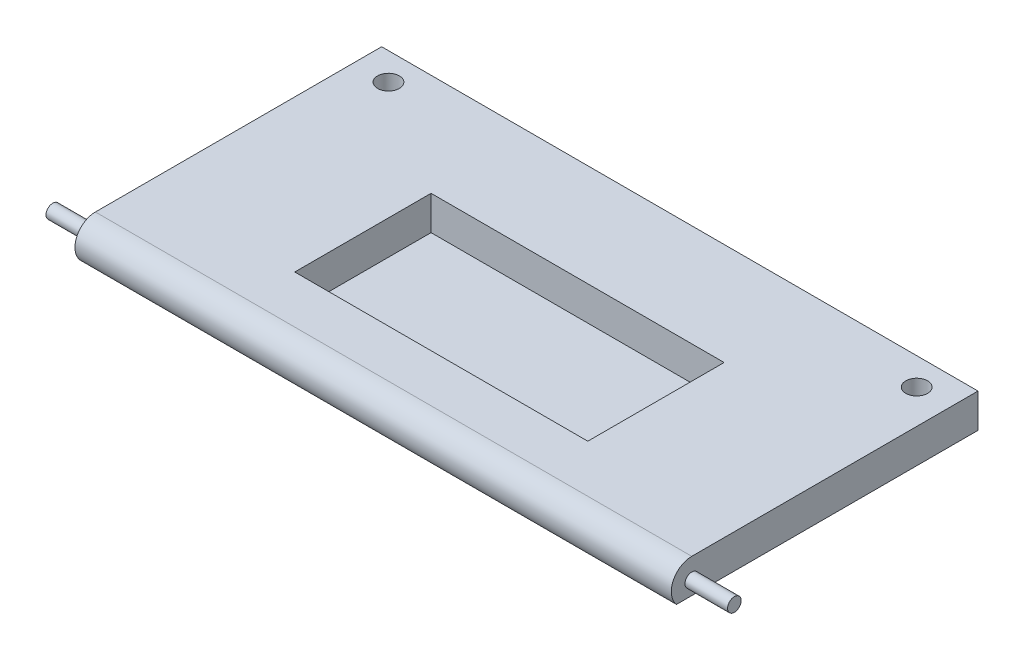
ISO-10303-21;
HEADER;
FILE_DESCRIPTION(('STEP AP214'),'2;1');
FILE_NAME('part.step','',(''),(''),'','','');
FILE_SCHEMA(('AUTOMOTIVE_DESIGN { 1 0 10303 214 1 1 1 1 }'));
ENDSEC;
DATA;
#1=APPLICATION_CONTEXT('core data for automotive mechanical design processes');
#2=APPLICATION_PROTOCOL_DEFINITION('international standard','automotive_design',2000,#1);
#3=PRODUCT_CONTEXT('',#1,'mechanical');
#4=PRODUCT('Part','Part','',(#3));
#5=PRODUCT_RELATED_PRODUCT_CATEGORY('part','',(#4));
#6=PRODUCT_DEFINITION_FORMATION('','',#4);
#7=PRODUCT_DEFINITION_CONTEXT('part definition',#1,'design');
#8=PRODUCT_DEFINITION('design','',#6,#7);
#9=PRODUCT_DEFINITION_SHAPE('','',#8);
#10=(LENGTH_UNIT() NAMED_UNIT(*) SI_UNIT(.MILLI.,.METRE.));
#11=(NAMED_UNIT(*) PLANE_ANGLE_UNIT() SI_UNIT($,.RADIAN.));
#12=(NAMED_UNIT(*) SI_UNIT($,.STERADIAN.) SOLID_ANGLE_UNIT());
#13=UNCERTAINTY_MEASURE_WITH_UNIT(LENGTH_MEASURE(1.E-05),#10,'distance_accuracy_value','');
#14=(GEOMETRIC_REPRESENTATION_CONTEXT(3) GLOBAL_UNCERTAINTY_ASSIGNED_CONTEXT((#13)) GLOBAL_UNIT_ASSIGNED_CONTEXT((#10,
#11,#12)) REPRESENTATION_CONTEXT('',''));
#15=CARTESIAN_POINT('',(0.,0.,0.));
#16=DIRECTION('',(0.,0.,1.));
#17=DIRECTION('',(1.,0.,0.));
#18=AXIS2_PLACEMENT_3D('',#15,#16,#17);
#19=CARTESIAN_POINT('',(-43.75,-0.5,42.));
#20=DIRECTION('',(-1.,0.,0.));
#21=DIRECTION('',(0.,0.,1.));
#22=AXIS2_PLACEMENT_3D('',#19,#20,#21);
#23=CYLINDRICAL_SURFACE('',#22,3.);
#24=DIRECTION('',(-1.,0.,0.));
#25=VECTOR('',#24,1.);
#26=CARTESIAN_POINT('',(-43.75,2.5,42.));
#27=LINE('',#26,#25);
#28=CARTESIAN_POINT('',(-43.75,2.5,42.));
#29=VERTEX_POINT('',#28);
#30=CARTESIAN_POINT('',(43.75,2.5,42.));
#31=VERTEX_POINT('',#30);
#32=EDGE_CURVE('E209',#29,#31,#27,.F.);
#33=ORIENTED_EDGE('',*,*,#32,.F.);
#34=CARTESIAN_POINT('',(-43.75,-0.5,42.));
#35=DIRECTION('',(1.,0.,0.));
#36=DIRECTION('',(0.,0.,-1.));
#37=AXIS2_PLACEMENT_3D('',#34,#35,#36);
#38=CIRCLE('',#37,3.);
#39=CARTESIAN_POINT('',(-43.75,-2.5,44.2360679774998));
#40=VERTEX_POINT('',#39);
#41=EDGE_CURVE('E11',#40,#29,#38,.F.);
#42=ORIENTED_EDGE('',*,*,#41,.F.);
#43=DIRECTION('',(-1.,0.,0.));
#44=VECTOR('',#43,1.);
#45=CARTESIAN_POINT('',(-43.75,-2.5,44.2360679774998));
#46=LINE('',#45,#44);
#47=CARTESIAN_POINT('',(-34.,-2.5,44.2360679774998));
#48=VERTEX_POINT('',#47);
#49=EDGE_CURVE('E48',#48,#40,#46,.T.);
#50=ORIENTED_EDGE('',*,*,#49,.F.);
#51=CARTESIAN_POINT('',(-34.,-0.5,42.));
#52=DIRECTION('',(1.,0.,0.));
#53=DIRECTION('',(0.,0.,-1.));
#54=AXIS2_PLACEMENT_3D('',#51,#52,#53);
#55=CIRCLE('',#54,3.);
#56=CARTESIAN_POINT('',(-34.,-3.5,42.));
#57=VERTEX_POINT('',#56);
#58=EDGE_CURVE('E224',#57,#48,#55,.F.);
#59=ORIENTED_EDGE('',*,*,#58,.F.);
#60=DIRECTION('',(-1.,0.,0.));
#61=VECTOR('',#60,1.);
#62=CARTESIAN_POINT('',(-34.,-3.5,42.));
#63=LINE('',#62,#61);
#64=CARTESIAN_POINT('',(34.,-3.5,42.));
#65=VERTEX_POINT('',#64);
#66=EDGE_CURVE('E221',#65,#57,#63,.T.);
#67=ORIENTED_EDGE('',*,*,#66,.F.);
#68=CARTESIAN_POINT('',(34.,-0.5,42.));
#69=DIRECTION('',(-1.,0.,0.));
#70=DIRECTION('',(0.,0.,1.));
#71=AXIS2_PLACEMENT_3D('',#68,#69,#70);
#72=CIRCLE('',#71,3.);
#73=CARTESIAN_POINT('',(34.,-2.5,44.2360679774998));
#74=VERTEX_POINT('',#73);
#75=EDGE_CURVE('E218',#74,#65,#72,.F.);
#76=ORIENTED_EDGE('',*,*,#75,.F.);
#77=DIRECTION('',(-1.,0.,0.));
#78=VECTOR('',#77,1.);
#79=CARTESIAN_POINT('',(-43.75,-2.5,44.2360679774998));
#80=LINE('',#79,#78);
#81=CARTESIAN_POINT('',(43.75,-2.5,44.2360679774998));
#82=VERTEX_POINT('',#81);
#83=EDGE_CURVE('E215',#82,#74,#80,.T.);
#84=ORIENTED_EDGE('',*,*,#83,.F.);
#85=CARTESIAN_POINT('',(43.75,-0.5,42.));
#86=DIRECTION('',(-1.,0.,0.));
#87=DIRECTION('',(0.,0.,1.));
#88=AXIS2_PLACEMENT_3D('',#85,#86,#87);
#89=CIRCLE('',#88,3.);
#90=EDGE_CURVE('E212',#31,#82,#89,.F.);
#91=ORIENTED_EDGE('',*,*,#90,.F.);
#92=EDGE_LOOP('',(#33,#42,#50,#59,#67,#76,#84,#91));
#93=FACE_BOUND('',#92,.T.);
#94=ADVANCED_FACE('F39',(#93),#23,.T.);
#95=CARTESIAN_POINT('',(43.75,-2.5,45.));
#96=DIRECTION('',(-1.,0.,0.));
#97=DIRECTION('',(0.,0.,1.));
#98=AXIS2_PLACEMENT_3D('',#95,#96,#97);
#99=PLANE('',#98);
#100=CARTESIAN_POINT('',(43.75,-0.5,42.));
#101=DIRECTION('',(-1.,0.,0.));
#102=DIRECTION('',(0.,0.,1.));
#103=AXIS2_PLACEMENT_3D('',#100,#101,#102);
#104=CIRCLE('',#103,0.999999999999998);
#105=CARTESIAN_POINT('',(43.75,-0.5,41.));
#106=VERTEX_POINT('',#105);
#107=EDGE_CURVE('E154',#106,#106,#104,.T.);
#108=ORIENTED_EDGE('',*,*,#107,.T.);
#109=EDGE_LOOP('',(#108));
#110=FACE_BOUND('',#109,.T.);
#111=DIRECTION('',(0.,0.,-1.));
#112=VECTOR('',#111,1.);
#113=CARTESIAN_POINT('',(43.75,2.5,45.));
#114=LINE('',#113,#112);
#115=CARTESIAN_POINT('',(43.75,2.5,0.));
#116=VERTEX_POINT('',#115);
#117=EDGE_CURVE('E207',#31,#116,#114,.T.);
#118=ORIENTED_EDGE('',*,*,#117,.F.);
#119=ORIENTED_EDGE('',*,*,#90,.T.);
#120=DIRECTION('',(0.,0.,-1.));
#121=VECTOR('',#120,1.);
#122=CARTESIAN_POINT('',(43.75,-2.5,45.));
#123=LINE('',#122,#121);
#124=CARTESIAN_POINT('',(43.75,-2.5,0.));
#125=VERTEX_POINT('',#124);
#126=EDGE_CURVE('E193',#82,#125,#123,.T.);
#127=ORIENTED_EDGE('',*,*,#126,.T.);
#128=DIRECTION('',(0.,1.,0.));
#129=VECTOR('',#128,1.);
#130=CARTESIAN_POINT('',(43.75,-2.5,0.));
#131=LINE('',#130,#129);
#132=EDGE_CURVE('E166',#125,#116,#131,.T.);
#133=ORIENTED_EDGE('',*,*,#132,.T.);
#134=EDGE_LOOP('',(#118,#119,#127,#133));
#135=FACE_BOUND('',#134,.T.);
#136=ADVANCED_FACE('F257',(#110,#135),#99,.F.);
#137=CARTESIAN_POINT('',(-43.75,2.5,45.));
#138=DIRECTION('',(0.,-1.,0.));
#139=DIRECTION('',(0.,0.,-1.));
#140=AXIS2_PLACEMENT_3D('',#137,#138,#139);
#141=PLANE('',#140);
#142=CARTESIAN_POINT('',(38.75,2.5,4.));
#143=DIRECTION('',(0.,-1.,0.));
#144=DIRECTION('',(0.,0.,-1.));
#145=AXIS2_PLACEMENT_3D('',#142,#143,#144);
#146=CIRCLE('',#145,1.6);
#147=CARTESIAN_POINT('',(38.75,2.5,2.4));
#148=VERTEX_POINT('',#147);
#149=EDGE_CURVE('E456',#148,#148,#146,.T.);
#150=ORIENTED_EDGE('',*,*,#149,.T.);
#151=EDGE_LOOP('',(#150));
#152=FACE_BOUND('',#151,.T.);
#153=CARTESIAN_POINT('',(-38.75,2.5,4.));
#154=DIRECTION('',(0.,-1.,0.));
#155=DIRECTION('',(0.,0.,-1.));
#156=AXIS2_PLACEMENT_3D('',#153,#154,#155);
#157=CIRCLE('',#156,1.6);
#158=CARTESIAN_POINT('',(-38.75,2.5,2.4));
#159=VERTEX_POINT('',#158);
#160=EDGE_CURVE('E463',#159,#159,#157,.F.);
#161=ORIENTED_EDGE('',*,*,#160,.F.);
#162=EDGE_LOOP('',(#161));
#163=FACE_BOUND('',#162,.T.);
#164=DIRECTION('',(-1.,0.,0.));
#165=VECTOR('',#164,1.);
#166=CARTESIAN_POINT('',(-21.5,2.5,15.));
#167=LINE('',#166,#165);
#168=CARTESIAN_POINT('',(21.5,2.5,15.));
#169=VERTEX_POINT('',#168);
#170=CARTESIAN_POINT('',(-21.5,2.5,15.));
#171=VERTEX_POINT('',#170);
#172=EDGE_CURVE('E160',#169,#171,#167,.T.);
#173=ORIENTED_EDGE('',*,*,#172,.F.);
#174=DIRECTION('',(0.,0.,-1.));
#175=VECTOR('',#174,1.);
#176=CARTESIAN_POINT('',(21.5,2.5,35.));
#177=LINE('',#176,#175);
#178=CARTESIAN_POINT('',(21.5,2.5,35.));
#179=VERTEX_POINT('',#178);
#180=EDGE_CURVE('E131',#179,#169,#177,.T.);
#181=ORIENTED_EDGE('',*,*,#180,.F.);
#182=DIRECTION('',(1.,0.,0.));
#183=VECTOR('',#182,1.);
#184=CARTESIAN_POINT('',(-21.5,2.5,35.));
#185=LINE('',#184,#183);
#186=CARTESIAN_POINT('',(-21.5,2.5,35.));
#187=VERTEX_POINT('',#186);
#188=EDGE_CURVE('E148',#187,#179,#185,.T.);
#189=ORIENTED_EDGE('',*,*,#188,.F.);
#190=DIRECTION('',(0.,0.,1.));
#191=VECTOR('',#190,1.);
#192=CARTESIAN_POINT('',(-21.5,2.5,35.));
#193=LINE('',#192,#191);
#194=EDGE_CURVE('E151',#171,#187,#193,.T.);
#195=ORIENTED_EDGE('',*,*,#194,.F.);
#196=EDGE_LOOP('',(#173,#181,#189,#195));
#197=FACE_BOUND('',#196,.T.);
#198=DIRECTION('',(0.,0.,-1.));
#199=VECTOR('',#198,1.);
#200=CARTESIAN_POINT('',(-43.75,2.5,45.));
#201=LINE('',#200,#199);
#202=CARTESIAN_POINT('',(-43.75,2.5,0.));
#203=VERTEX_POINT('',#202);
#204=EDGE_CURVE('E205',#29,#203,#201,.T.);
#205=ORIENTED_EDGE('',*,*,#204,.F.);
#206=ORIENTED_EDGE('',*,*,#32,.T.);
#207=ORIENTED_EDGE('',*,*,#117,.T.);
#208=DIRECTION('',(-1.,0.,0.));
#209=VECTOR('',#208,1.);
#210=CARTESIAN_POINT('',(-43.75,2.5,0.));
#211=LINE('',#210,#209);
#212=EDGE_CURVE('E172',#116,#203,#211,.T.);
#213=ORIENTED_EDGE('',*,*,#212,.T.);
#214=EDGE_LOOP('',(#205,#206,#207,#213));
#215=FACE_BOUND('',#214,.T.);
#216=ADVANCED_FACE('F259',(#152,#163,#197,#215),#141,.F.);
#217=CARTESIAN_POINT('',(-43.75,-2.5,45.));
#218=DIRECTION('',(1.,0.,0.));
#219=DIRECTION('',(0.,0.,-1.));
#220=AXIS2_PLACEMENT_3D('',#217,#218,#219);
#221=PLANE('',#220);
#222=CARTESIAN_POINT('',(-43.75,-0.5,42.));
#223=DIRECTION('',(1.,0.,0.));
#224=DIRECTION('',(0.,0.,-1.));
#225=AXIS2_PLACEMENT_3D('',#222,#223,#224);
#226=CIRCLE('',#225,0.999999999999998);
#227=CARTESIAN_POINT('',(-43.75,-0.5,41.));
#228=VERTEX_POINT('',#227);
#229=EDGE_CURVE('E43',#228,#228,#226,.T.);
#230=ORIENTED_EDGE('',*,*,#229,.T.);
#231=EDGE_LOOP('',(#230));
#232=FACE_BOUND('',#231,.T.);
#233=DIRECTION('',(0.,0.,-1.));
#234=VECTOR('',#233,1.);
#235=CARTESIAN_POINT('',(-43.75,-2.5,45.));
#236=LINE('',#235,#234);
#237=CARTESIAN_POINT('',(-43.75,-2.5,0.));
#238=VERTEX_POINT('',#237);
#239=EDGE_CURVE('E203',#40,#238,#236,.T.);
#240=ORIENTED_EDGE('',*,*,#239,.F.);
#241=ORIENTED_EDGE('',*,*,#41,.T.);
#242=ORIENTED_EDGE('',*,*,#204,.T.);
#243=DIRECTION('',(0.,-1.,0.));
#244=VECTOR('',#243,1.);
#245=CARTESIAN_POINT('',(-43.75,-2.5,0.));
#246=LINE('',#245,#244);
#247=EDGE_CURVE('E175',#203,#238,#246,.T.);
#248=ORIENTED_EDGE('',*,*,#247,.T.);
#249=EDGE_LOOP('',(#240,#241,#242,#248));
#250=FACE_BOUND('',#249,.T.);
#251=ADVANCED_FACE('F231',(#232,#250),#221,.F.);
#252=CARTESIAN_POINT('',(-43.75,-2.5,45.));
#253=DIRECTION('',(0.,1.,0.));
#254=DIRECTION('',(0.,0.,1.));
#255=AXIS2_PLACEMENT_3D('',#252,#253,#254);
#256=PLANE('',#255);
#257=CARTESIAN_POINT('',(-38.75,-2.5,4.));
#258=DIRECTION('',(0.,-1.,0.));
#259=DIRECTION('',(0.,0.,-1.));
#260=AXIS2_PLACEMENT_3D('',#257,#258,#259);
#261=CIRCLE('',#260,1.6);
#262=CARTESIAN_POINT('',(-38.75,-2.5,2.4));
#263=VERTEX_POINT('',#262);
#264=EDGE_CURVE('E458',#263,#263,#261,.T.);
#265=ORIENTED_EDGE('',*,*,#264,.F.);
#266=EDGE_LOOP('',(#265));
#267=FACE_BOUND('',#266,.T.);
#268=DIRECTION('',(0.,0.,-1.));
#269=VECTOR('',#268,1.);
#270=CARTESIAN_POINT('',(-34.,-2.5,45.));
#271=LINE('',#270,#269);
#272=CARTESIAN_POINT('',(-34.,-2.5,0.));
#273=VERTEX_POINT('',#272);
#274=EDGE_CURVE('E201',#48,#273,#271,.T.);
#275=ORIENTED_EDGE('',*,*,#274,.F.);
#276=ORIENTED_EDGE('',*,*,#49,.T.);
#277=ORIENTED_EDGE('',*,*,#239,.T.);
#278=DIRECTION('',(1.,0.,0.));
#279=VECTOR('',#278,1.);
#280=CARTESIAN_POINT('',(-43.75,-2.5,0.));
#281=LINE('',#280,#279);
#282=EDGE_CURVE('E178',#238,#273,#281,.T.);
#283=ORIENTED_EDGE('',*,*,#282,.T.);
#284=EDGE_LOOP('',(#275,#276,#277,#283));
#285=FACE_BOUND('',#284,.T.);
#286=ADVANCED_FACE('F229',(#267,#285),#256,.F.);
#287=CARTESIAN_POINT('',(-34.,-3.5,45.));
#288=DIRECTION('',(1.,0.,0.));
#289=DIRECTION('',(0.,0.,-1.));
#290=AXIS2_PLACEMENT_3D('',#287,#288,#289);
#291=PLANE('',#290);
#292=DIRECTION('',(0.,0.,-1.));
#293=VECTOR('',#292,1.);
#294=CARTESIAN_POINT('',(-34.,-3.5,45.));
#295=LINE('',#294,#293);
#296=CARTESIAN_POINT('',(-34.,-3.5,0.));
#297=VERTEX_POINT('',#296);
#298=EDGE_CURVE('E199',#57,#297,#295,.T.);
#299=ORIENTED_EDGE('',*,*,#298,.F.);
#300=ORIENTED_EDGE('',*,*,#58,.T.);
#301=ORIENTED_EDGE('',*,*,#274,.T.);
#302=DIRECTION('',(0.,-1.,0.));
#303=VECTOR('',#302,1.);
#304=CARTESIAN_POINT('',(-34.,-3.5,0.));
#305=LINE('',#304,#303);
#306=EDGE_CURVE('E181',#273,#297,#305,.T.);
#307=ORIENTED_EDGE('',*,*,#306,.T.);
#308=EDGE_LOOP('',(#299,#300,#301,#307));
#309=FACE_BOUND('',#308,.T.);
#310=ADVANCED_FACE('F244',(#309),#291,.F.);
#311=CARTESIAN_POINT('',(-34.,-3.5,45.));
#312=DIRECTION('',(0.,1.,0.));
#313=DIRECTION('',(0.,0.,1.));
#314=AXIS2_PLACEMENT_3D('',#311,#312,#313);
#315=PLANE('',#314);
#316=DIRECTION('',(0.,0.,-1.));
#317=VECTOR('',#316,1.);
#318=CARTESIAN_POINT('',(34.,-3.5,45.));
#319=LINE('',#318,#317);
#320=CARTESIAN_POINT('',(34.,-3.5,0.));
#321=VERTEX_POINT('',#320);
#322=EDGE_CURVE('E197',#65,#321,#319,.T.);
#323=ORIENTED_EDGE('',*,*,#322,.F.);
#324=ORIENTED_EDGE('',*,*,#66,.T.);
#325=ORIENTED_EDGE('',*,*,#298,.T.);
#326=DIRECTION('',(1.,0.,0.));
#327=VECTOR('',#326,1.);
#328=CARTESIAN_POINT('',(-34.,-3.5,0.));
#329=LINE('',#328,#327);
#330=EDGE_CURVE('E184',#297,#321,#329,.T.);
#331=ORIENTED_EDGE('',*,*,#330,.T.);
#332=EDGE_LOOP('',(#323,#324,#325,#331));
#333=FACE_BOUND('',#332,.T.);
#334=ADVANCED_FACE('F247',(#333),#315,.F.);
#335=CARTESIAN_POINT('',(34.,-3.5,45.));
#336=DIRECTION('',(-1.,0.,0.));
#337=DIRECTION('',(0.,0.,1.));
#338=AXIS2_PLACEMENT_3D('',#335,#336,#337);
#339=PLANE('',#338);
#340=DIRECTION('',(0.,0.,-1.));
#341=VECTOR('',#340,1.);
#342=CARTESIAN_POINT('',(34.,-2.5,45.));
#343=LINE('',#342,#341);
#344=CARTESIAN_POINT('',(34.,-2.5,0.));
#345=VERTEX_POINT('',#344);
#346=EDGE_CURVE('E195',#74,#345,#343,.T.);
#347=ORIENTED_EDGE('',*,*,#346,.F.);
#348=ORIENTED_EDGE('',*,*,#75,.T.);
#349=ORIENTED_EDGE('',*,*,#322,.T.);
#350=DIRECTION('',(0.,1.,0.));
#351=VECTOR('',#350,1.);
#352=CARTESIAN_POINT('',(34.,-3.5,0.));
#353=LINE('',#352,#351);
#354=EDGE_CURVE('E187',#321,#345,#353,.T.);
#355=ORIENTED_EDGE('',*,*,#354,.T.);
#356=EDGE_LOOP('',(#347,#348,#349,#355));
#357=FACE_BOUND('',#356,.T.);
#358=ADVANCED_FACE('F250',(#357),#339,.F.);
#359=CARTESIAN_POINT('',(34.,-2.5,45.));
#360=DIRECTION('',(0.,1.,0.));
#361=DIRECTION('',(0.,0.,1.));
#362=AXIS2_PLACEMENT_3D('',#359,#360,#361);
#363=PLANE('',#362);
#364=CARTESIAN_POINT('',(38.75,-2.5,4.));
#365=DIRECTION('',(0.,1.,0.));
#366=DIRECTION('',(0.,0.,-1.));
#367=AXIS2_PLACEMENT_3D('',#364,#365,#366);
#368=CIRCLE('',#367,1.6);
#369=CARTESIAN_POINT('',(38.75,-2.5,2.4));
#370=VERTEX_POINT('',#369);
#371=EDGE_CURVE('E454',#370,#370,#368,.T.);
#372=ORIENTED_EDGE('',*,*,#371,.T.);
#373=EDGE_LOOP('',(#372));
#374=FACE_BOUND('',#373,.T.);
#375=ORIENTED_EDGE('',*,*,#126,.F.);
#376=ORIENTED_EDGE('',*,*,#83,.T.);
#377=ORIENTED_EDGE('',*,*,#346,.T.);
#378=DIRECTION('',(1.,0.,0.));
#379=VECTOR('',#378,1.);
#380=CARTESIAN_POINT('',(34.,-2.5,0.));
#381=LINE('',#380,#379);
#382=EDGE_CURVE('E190',#345,#125,#381,.T.);
#383=ORIENTED_EDGE('',*,*,#382,.T.);
#384=EDGE_LOOP('',(#375,#376,#377,#383));
#385=FACE_BOUND('',#384,.T.);
#386=ADVANCED_FACE('F254',(#374,#385),#363,.F.);
#387=CARTESIAN_POINT('',(0.,0.,0.));
#388=DIRECTION('',(0.,0.,-1.));
#389=DIRECTION('',(-1.,0.,0.));
#390=AXIS2_PLACEMENT_3D('',#387,#388,#389);
#391=PLANE('',#390);
#392=ORIENTED_EDGE('',*,*,#132,.F.);
#393=ORIENTED_EDGE('',*,*,#382,.F.);
#394=ORIENTED_EDGE('',*,*,#354,.F.);
#395=ORIENTED_EDGE('',*,*,#330,.F.);
#396=ORIENTED_EDGE('',*,*,#306,.F.);
#397=ORIENTED_EDGE('',*,*,#282,.F.);
#398=ORIENTED_EDGE('',*,*,#247,.F.);
#399=ORIENTED_EDGE('',*,*,#212,.F.);
#400=EDGE_LOOP('',(#392,#393,#394,#395,#396,#397,#398,#399));
#401=FACE_BOUND('',#400,.T.);
#402=ADVANCED_FACE('F239',(#401),#391,.T.);
#403=CARTESIAN_POINT('',(21.5,-2.5,35.));
#404=DIRECTION('',(1.,0.,0.));
#405=DIRECTION('',(0.,0.,-1.));
#406=AXIS2_PLACEMENT_3D('',#403,#404,#405);
#407=PLANE('',#406);
#408=ORIENTED_EDGE('',*,*,#180,.T.);
#409=DIRECTION('',(0.,1.,0.));
#410=VECTOR('',#409,1.);
#411=CARTESIAN_POINT('',(21.5,-2.5,15.));
#412=LINE('',#411,#410);
#413=CARTESIAN_POINT('',(21.5,-2.5,15.));
#414=VERTEX_POINT('',#413);
#415=EDGE_CURVE('E124',#414,#169,#412,.T.);
#416=ORIENTED_EDGE('',*,*,#415,.F.);
#417=DIRECTION('',(0.,0.,-1.));
#418=VECTOR('',#417,1.);
#419=CARTESIAN_POINT('',(21.5,-2.5,35.));
#420=LINE('',#419,#418);
#421=CARTESIAN_POINT('',(21.5,-2.5,35.));
#422=VERTEX_POINT('',#421);
#423=EDGE_CURVE('E128',#422,#414,#420,.T.);
#424=ORIENTED_EDGE('',*,*,#423,.F.);
#425=DIRECTION('',(0.,1.,0.));
#426=VECTOR('',#425,1.);
#427=CARTESIAN_POINT('',(21.5,-2.5,35.));
#428=LINE('',#427,#426);
#429=EDGE_CURVE('E164',#422,#179,#428,.T.);
#430=ORIENTED_EDGE('',*,*,#429,.T.);
#431=EDGE_LOOP('',(#408,#416,#424,#430));
#432=FACE_BOUND('',#431,.T.);
#433=ADVANCED_FACE('F126',(#432),#407,.F.);
#434=CARTESIAN_POINT('',(-21.5,-2.5,35.));
#435=DIRECTION('',(0.,0.,1.));
#436=DIRECTION('',(1.,0.,0.));
#437=AXIS2_PLACEMENT_3D('',#434,#435,#436);
#438=PLANE('',#437);
#439=ORIENTED_EDGE('',*,*,#188,.T.);
#440=ORIENTED_EDGE('',*,*,#429,.F.);
#441=DIRECTION('',(1.,0.,0.));
#442=VECTOR('',#441,1.);
#443=CARTESIAN_POINT('',(-21.5,-2.5,35.));
#444=LINE('',#443,#442);
#445=CARTESIAN_POINT('',(-21.5,-2.5,35.));
#446=VERTEX_POINT('',#445);
#447=EDGE_CURVE('E136',#446,#422,#444,.T.);
#448=ORIENTED_EDGE('',*,*,#447,.F.);
#449=DIRECTION('',(0.,1.,0.));
#450=VECTOR('',#449,1.);
#451=CARTESIAN_POINT('',(-21.5,-2.5,35.));
#452=LINE('',#451,#450);
#453=EDGE_CURVE('E167',#446,#187,#452,.T.);
#454=ORIENTED_EDGE('',*,*,#453,.T.);
#455=EDGE_LOOP('',(#439,#440,#448,#454));
#456=FACE_BOUND('',#455,.T.);
#457=ADVANCED_FACE('F386',(#456),#438,.F.);
#458=CARTESIAN_POINT('',(-21.5,-2.5,35.));
#459=DIRECTION('',(-1.,0.,0.));
#460=DIRECTION('',(0.,0.,1.));
#461=AXIS2_PLACEMENT_3D('',#458,#459,#460);
#462=PLANE('',#461);
#463=ORIENTED_EDGE('',*,*,#194,.T.);
#464=ORIENTED_EDGE('',*,*,#453,.F.);
#465=DIRECTION('',(0.,0.,1.));
#466=VECTOR('',#465,1.);
#467=CARTESIAN_POINT('',(-21.5,-2.5,35.));
#468=LINE('',#467,#466);
#469=CARTESIAN_POINT('',(-21.5,-2.5,15.));
#470=VERTEX_POINT('',#469);
#471=EDGE_CURVE('E144',#470,#446,#468,.T.);
#472=ORIENTED_EDGE('',*,*,#471,.F.);
#473=DIRECTION('',(0.,1.,0.));
#474=VECTOR('',#473,1.);
#475=CARTESIAN_POINT('',(-21.5,-2.5,15.));
#476=LINE('',#475,#474);
#477=EDGE_CURVE('E135',#470,#171,#476,.T.);
#478=ORIENTED_EDGE('',*,*,#477,.T.);
#479=EDGE_LOOP('',(#463,#464,#472,#478));
#480=FACE_BOUND('',#479,.T.);
#481=ADVANCED_FACE('F389',(#480),#462,.F.);
#482=CARTESIAN_POINT('',(-21.5,-2.5,15.));
#483=DIRECTION('',(0.,0.,-1.));
#484=DIRECTION('',(-1.,0.,0.));
#485=AXIS2_PLACEMENT_3D('',#482,#483,#484);
#486=PLANE('',#485);
#487=ORIENTED_EDGE('',*,*,#172,.T.);
#488=ORIENTED_EDGE('',*,*,#477,.F.);
#489=DIRECTION('',(-1.,0.,0.));
#490=VECTOR('',#489,1.);
#491=CARTESIAN_POINT('',(-21.5,-2.5,15.));
#492=LINE('',#491,#490);
#493=EDGE_CURVE('E139',#414,#470,#492,.T.);
#494=ORIENTED_EDGE('',*,*,#493,.F.);
#495=ORIENTED_EDGE('',*,*,#415,.T.);
#496=EDGE_LOOP('',(#487,#488,#494,#495));
#497=FACE_BOUND('',#496,.T.);
#498=ADVANCED_FACE('F140',(#497),#486,.F.);
#499=CARTESIAN_POINT('',(0.,-2.5,0.));
#500=DIRECTION('',(0.,-1.,0.));
#501=DIRECTION('',(0.,0.,-1.));
#502=AXIS2_PLACEMENT_3D('',#499,#500,#501);
#503=PLANE('',#502);
#504=ORIENTED_EDGE('',*,*,#423,.T.);
#505=ORIENTED_EDGE('',*,*,#493,.T.);
#506=ORIENTED_EDGE('',*,*,#471,.T.);
#507=ORIENTED_EDGE('',*,*,#447,.T.);
#508=EDGE_LOOP('',(#504,#505,#506,#507));
#509=FACE_BOUND('',#508,.T.);
#510=ADVANCED_FACE('F146',(#509),#503,.F.);
#511=CARTESIAN_POINT('',(-50.,-0.5,42.));
#512=DIRECTION('',(1.,0.,0.));
#513=DIRECTION('',(0.,0.,-1.));
#514=AXIS2_PLACEMENT_3D('',#511,#512,#513);
#515=PLANE('',#514);
#516=CARTESIAN_POINT('',(-50.,-0.5,42.));
#517=DIRECTION('',(1.,0.,0.));
#518=DIRECTION('',(0.,0.,-1.));
#519=AXIS2_PLACEMENT_3D('',#516,#517,#518);
#520=CIRCLE('',#519,0.999999999999998);
#521=CARTESIAN_POINT('',(-50.,-0.5,41.));
#522=VERTEX_POINT('',#521);
#523=EDGE_CURVE('E467',#522,#522,#520,.T.);
#524=ORIENTED_EDGE('',*,*,#523,.F.);
#525=EDGE_LOOP('',(#524));
#526=FACE_BOUND('',#525,.T.);
#527=ADVANCED_FACE('F300',(#526),#515,.F.);
#528=CARTESIAN_POINT('',(-50.,-0.5,42.));
#529=DIRECTION('',(1.,0.,0.));
#530=DIRECTION('',(0.,0.,-1.));
#531=AXIS2_PLACEMENT_3D('',#528,#529,#530);
#532=CYLINDRICAL_SURFACE('',#531,0.999999999999998);
#533=CARTESIAN_POINT('',(-50.,-0.5,41.));
#534=CARTESIAN_POINT('',(-49.9348958333333,-0.5,41.));
#535=CARTESIAN_POINT('',(-49.8697916666667,-0.5,41.));
#536=CARTESIAN_POINT('',(-49.7395833333333,-0.5,41.));
#537=CARTESIAN_POINT('',(-49.6744791666667,-0.5,41.));
#538=CARTESIAN_POINT('',(-49.5442708333333,-0.5,41.));
#539=CARTESIAN_POINT('',(-49.4791666666667,-0.5,41.));
#540=CARTESIAN_POINT('',(-49.3489583333333,-0.5,41.));
#541=CARTESIAN_POINT('',(-49.2838541666667,-0.5,41.));
#542=CARTESIAN_POINT('',(-49.1536458333333,-0.5,41.));
#543=CARTESIAN_POINT('',(-49.0885416666667,-0.5,41.));
#544=CARTESIAN_POINT('',(-48.9583333333333,-0.5,41.));
#545=CARTESIAN_POINT('',(-48.8932291666667,-0.5,41.));
#546=CARTESIAN_POINT('',(-48.7630208333333,-0.5,41.));
#547=CARTESIAN_POINT('',(-48.6979166666667,-0.5,41.));
#548=CARTESIAN_POINT('',(-48.5677083333333,-0.5,41.));
#549=CARTESIAN_POINT('',(-48.5026041666667,-0.5,41.));
#550=CARTESIAN_POINT('',(-48.3723958333333,-0.5,41.));
#551=CARTESIAN_POINT('',(-48.3072916666667,-0.5,41.));
#552=CARTESIAN_POINT('',(-48.1770833333333,-0.5,41.));
#553=CARTESIAN_POINT('',(-48.1119791666667,-0.5,41.));
#554=CARTESIAN_POINT('',(-47.9817708333333,-0.5,41.));
#555=CARTESIAN_POINT('',(-47.9166666666667,-0.5,41.));
#556=CARTESIAN_POINT('',(-47.7864583333333,-0.5,41.));
#557=CARTESIAN_POINT('',(-47.7213541666667,-0.5,41.));
#558=CARTESIAN_POINT('',(-47.5911458333333,-0.5,41.));
#559=CARTESIAN_POINT('',(-47.5260416666667,-0.5,41.));
#560=CARTESIAN_POINT('',(-47.3958333333333,-0.5,41.));
#561=CARTESIAN_POINT('',(-47.3307291666667,-0.5,41.));
#562=CARTESIAN_POINT('',(-47.2005208333333,-0.5,41.));
#563=CARTESIAN_POINT('',(-47.1354166666667,-0.5,41.));
#564=CARTESIAN_POINT('',(-47.0052083333333,-0.5,41.));
#565=CARTESIAN_POINT('',(-46.9401041666667,-0.5,41.));
#566=CARTESIAN_POINT('',(-46.8098958333333,-0.5,41.));
#567=CARTESIAN_POINT('',(-46.7447916666667,-0.5,41.));
#568=CARTESIAN_POINT('',(-46.6145833333333,-0.5,41.));
#569=CARTESIAN_POINT('',(-46.5494791666667,-0.5,41.));
#570=CARTESIAN_POINT('',(-46.4192708333333,-0.5,41.));
#571=CARTESIAN_POINT('',(-46.3541666666667,-0.5,41.));
#572=CARTESIAN_POINT('',(-46.2239583333333,-0.5,41.));
#573=CARTESIAN_POINT('',(-46.1588541666667,-0.5,41.));
#574=CARTESIAN_POINT('',(-46.0286458333333,-0.5,41.));
#575=CARTESIAN_POINT('',(-45.9635416666667,-0.5,41.));
#576=CARTESIAN_POINT('',(-45.8333333333333,-0.5,41.));
#577=CARTESIAN_POINT('',(-45.7682291666667,-0.5,41.));
#578=CARTESIAN_POINT('',(-45.6380208333333,-0.5,41.));
#579=CARTESIAN_POINT('',(-45.5729166666667,-0.5,41.));
#580=CARTESIAN_POINT('',(-45.4427083333333,-0.5,41.));
#581=CARTESIAN_POINT('',(-45.3776041666667,-0.5,41.));
#582=CARTESIAN_POINT('',(-45.2473958333333,-0.5,41.));
#583=CARTESIAN_POINT('',(-45.1822916666667,-0.5,41.));
#584=CARTESIAN_POINT('',(-45.0520833333333,-0.5,41.));
#585=CARTESIAN_POINT('',(-44.9869791666667,-0.5,41.));
#586=CARTESIAN_POINT('',(-44.8567708333333,-0.5,41.));
#587=CARTESIAN_POINT('',(-44.7916666666667,-0.5,41.));
#588=CARTESIAN_POINT('',(-44.6614583333333,-0.5,41.));
#589=CARTESIAN_POINT('',(-44.5963541666667,-0.5,41.));
#590=CARTESIAN_POINT('',(-44.4661458333333,-0.5,41.));
#591=CARTESIAN_POINT('',(-44.4010416666667,-0.5,41.));
#592=CARTESIAN_POINT('',(-44.2708333333333,-0.5,41.));
#593=CARTESIAN_POINT('',(-44.2057291666667,-0.5,41.));
#594=CARTESIAN_POINT('',(-44.0755208333333,-0.5,41.));
#595=CARTESIAN_POINT('',(-44.0104166666667,-0.5,41.));
#596=CARTESIAN_POINT('',(-43.8802083333333,-0.5,41.));
#597=CARTESIAN_POINT('',(-43.8151041666667,-0.5,41.));
#598=CARTESIAN_POINT('',(-43.75,-0.5,41.));
#599=B_SPLINE_CURVE_WITH_KNOTS('',3,(#533,#534,#535,#536,#537,#538,#539,#540,#541,#542,#543,
#544,#545,#546,#547,#548,#549,#550,#551,#552,#553,#554,#555,#556,#557,#558,#559,#560,#561,#562,
#563,#564,#565,#566,#567,#568,#569,#570,#571,#572,#573,#574,#575,#576,#577,#578,#579,#580,#581,
#582,#583,#584,#585,#586,#587,#588,#589,#590,#591,#592,#593,#594,#595,#596,#597,#598),
.UNSPECIFIED.,.F.,.F.,(4,2,2,2,2,2,2,2,2,2,2,2,2,2,2,2,2,2,2,2,2,2,2,2,2,2,2,2,2,2,2,2,4),(0.,
0.195312500000003,0.390625000000006,0.585937500000001,0.781250000000004,0.9765625,1.171875,
1.36718750000001,1.5625,1.7578125,1.953125,2.1484375,2.34375000000001,2.5390625,2.734375,
2.9296875,3.125,3.32031250000001,3.515625,3.7109375,3.90625,4.1015625,4.29687500000001,
4.4921875,4.6875,4.8828125,5.078125,5.27343750000001,5.46875,5.6640625,5.859375,6.0546875,
6.25000000000001),.UNSPECIFIED.);
#600=EDGE_CURVE('BSEAM305',#522,#228,#599,.T.);
#601=ORIENTED_EDGE('',*,*,#523,.T.);
#602=ORIENTED_EDGE('',*,*,#229,.F.);
#603=ORIENTED_EDGE('',*,*,#600,.T.);
#604=ORIENTED_EDGE('',*,*,#600,.F.);
#605=EDGE_LOOP('',(#601,#603,#602,#604));
#606=FACE_BOUND('',#605,.T.);
#607=ADVANCED_FACE('F305',(#606),#532,.T.);
#608=CARTESIAN_POINT('',(50.,-0.5,42.));
#609=DIRECTION('',(1.,0.,0.));
#610=DIRECTION('',(0.,0.,-1.));
#611=AXIS2_PLACEMENT_3D('',#608,#609,#610);
#612=CIRCLE('',#611,0.999999999999998);
#613=CARTESIAN_POINT('',(50.,-0.5,41.));
#614=VERTEX_POINT('',#613);
#615=EDGE_CURVE('E466',#614,#614,#612,.T.);
#616=CARTESIAN_POINT('',(50.,-0.5,41.));
#617=CARTESIAN_POINT('',(49.9348958333333,-0.5,41.));
#618=CARTESIAN_POINT('',(49.8697916666667,-0.5,41.));
#619=CARTESIAN_POINT('',(49.7395833333333,-0.5,41.));
#620=CARTESIAN_POINT('',(49.6744791666667,-0.5,41.));
#621=CARTESIAN_POINT('',(49.5442708333333,-0.5,41.));
#622=CARTESIAN_POINT('',(49.4791666666667,-0.5,41.));
#623=CARTESIAN_POINT('',(49.3489583333333,-0.5,41.));
#624=CARTESIAN_POINT('',(49.2838541666667,-0.5,41.));
#625=CARTESIAN_POINT('',(49.1536458333333,-0.5,41.));
#626=CARTESIAN_POINT('',(49.0885416666667,-0.5,41.));
#627=CARTESIAN_POINT('',(48.9583333333333,-0.5,41.));
#628=CARTESIAN_POINT('',(48.8932291666667,-0.5,41.));
#629=CARTESIAN_POINT('',(48.7630208333333,-0.5,41.));
#630=CARTESIAN_POINT('',(48.6979166666667,-0.5,41.));
#631=CARTESIAN_POINT('',(48.5677083333333,-0.5,41.));
#632=CARTESIAN_POINT('',(48.5026041666667,-0.5,41.));
#633=CARTESIAN_POINT('',(48.3723958333333,-0.5,41.));
#634=CARTESIAN_POINT('',(48.3072916666667,-0.5,41.));
#635=CARTESIAN_POINT('',(48.1770833333333,-0.5,41.));
#636=CARTESIAN_POINT('',(48.1119791666667,-0.5,41.));
#637=CARTESIAN_POINT('',(47.9817708333333,-0.5,41.));
#638=CARTESIAN_POINT('',(47.9166666666667,-0.5,41.));
#639=CARTESIAN_POINT('',(47.7864583333333,-0.5,41.));
#640=CARTESIAN_POINT('',(47.7213541666667,-0.5,41.));
#641=CARTESIAN_POINT('',(47.5911458333333,-0.5,41.));
#642=CARTESIAN_POINT('',(47.5260416666667,-0.5,41.));
#643=CARTESIAN_POINT('',(47.3958333333333,-0.5,41.));
#644=CARTESIAN_POINT('',(47.3307291666667,-0.5,41.));
#645=CARTESIAN_POINT('',(47.2005208333333,-0.5,41.));
#646=CARTESIAN_POINT('',(47.1354166666667,-0.5,41.));
#647=CARTESIAN_POINT('',(47.0052083333333,-0.5,41.));
#648=CARTESIAN_POINT('',(46.9401041666667,-0.5,41.));
#649=CARTESIAN_POINT('',(46.8098958333333,-0.5,41.));
#650=CARTESIAN_POINT('',(46.7447916666667,-0.5,41.));
#651=CARTESIAN_POINT('',(46.6145833333333,-0.5,41.));
#652=CARTESIAN_POINT('',(46.5494791666667,-0.5,41.));
#653=CARTESIAN_POINT('',(46.4192708333333,-0.5,41.));
#654=CARTESIAN_POINT('',(46.3541666666667,-0.5,41.));
#655=CARTESIAN_POINT('',(46.2239583333333,-0.5,41.));
#656=CARTESIAN_POINT('',(46.1588541666667,-0.5,41.));
#657=CARTESIAN_POINT('',(46.0286458333333,-0.5,41.));
#658=CARTESIAN_POINT('',(45.9635416666667,-0.5,41.));
#659=CARTESIAN_POINT('',(45.8333333333333,-0.5,41.));
#660=CARTESIAN_POINT('',(45.7682291666667,-0.5,41.));
#661=CARTESIAN_POINT('',(45.6380208333333,-0.5,41.));
#662=CARTESIAN_POINT('',(45.5729166666667,-0.5,41.));
#663=CARTESIAN_POINT('',(45.4427083333333,-0.5,41.));
#664=CARTESIAN_POINT('',(45.3776041666667,-0.5,41.));
#665=CARTESIAN_POINT('',(45.2473958333333,-0.5,41.));
#666=CARTESIAN_POINT('',(45.1822916666667,-0.5,41.));
#667=CARTESIAN_POINT('',(45.0520833333333,-0.5,41.));
#668=CARTESIAN_POINT('',(44.9869791666667,-0.5,41.));
#669=CARTESIAN_POINT('',(44.8567708333333,-0.5,41.));
#670=CARTESIAN_POINT('',(44.7916666666667,-0.5,41.));
#671=CARTESIAN_POINT('',(44.6614583333333,-0.5,41.));
#672=CARTESIAN_POINT('',(44.5963541666667,-0.5,41.));
#673=CARTESIAN_POINT('',(44.4661458333333,-0.5,41.));
#674=CARTESIAN_POINT('',(44.4010416666667,-0.5,41.));
#675=CARTESIAN_POINT('',(44.2708333333333,-0.5,41.));
#676=CARTESIAN_POINT('',(44.2057291666667,-0.5,41.));
#677=CARTESIAN_POINT('',(44.0755208333333,-0.5,41.));
#678=CARTESIAN_POINT('',(44.0104166666667,-0.5,41.));
#679=CARTESIAN_POINT('',(43.8802083333333,-0.5,41.));
#680=CARTESIAN_POINT('',(43.8151041666667,-0.5,41.));
#681=CARTESIAN_POINT('',(43.75,-0.5,41.));
#682=B_SPLINE_CURVE_WITH_KNOTS('',3,(#616,#617,#618,#619,#620,#621,#622,#623,#624,#625,#626,
#627,#628,#629,#630,#631,#632,#633,#634,#635,#636,#637,#638,#639,#640,#641,#642,#643,#644,#645,
#646,#647,#648,#649,#650,#651,#652,#653,#654,#655,#656,#657,#658,#659,#660,#661,#662,#663,#664,
#665,#666,#667,#668,#669,#670,#671,#672,#673,#674,#675,#676,#677,#678,#679,#680,#681),
.UNSPECIFIED.,.F.,.F.,(4,2,2,2,2,2,2,2,2,2,2,2,2,2,2,2,2,2,2,2,2,2,2,2,2,2,2,2,2,2,2,2,4),(0.,
0.195312500000003,0.390625000000006,0.585937499999994,0.781249999999997,0.9765625,
1.17187499999999,1.36718749999999,1.56249999999999,1.7578125,1.953125,2.14843749999999,
2.34374999999999,2.53906249999999,2.73437499999998,2.92968749999999,3.12499999999999,
3.32031249999999,3.51562499999999,3.71093749999998,3.90624999999999,4.10156249999999,
4.29687499999998,4.49218749999998,4.68749999999998,4.88281249999999,5.07812499999999,
5.27343749999998,5.46874999999998,5.66406249999998,5.85937499999997,6.05468749999998,
6.24999999999998),.UNSPECIFIED.);
#683=EDGE_CURVE('BSEAM316',#614,#106,#682,.T.);
#684=ORIENTED_EDGE('',*,*,#615,.F.);
#685=ORIENTED_EDGE('',*,*,#107,.F.);
#686=ORIENTED_EDGE('',*,*,#683,.T.);
#687=ORIENTED_EDGE('',*,*,#683,.F.);
#688=EDGE_LOOP('',(#684,#686,#685,#687));
#689=FACE_BOUND('',#688,.T.);
#690=ADVANCED_FACE('F316',(#689),#532,.T.);
#691=CARTESIAN_POINT('',(50.,-0.5,42.));
#692=DIRECTION('',(1.,0.,0.));
#693=DIRECTION('',(0.,0.,-1.));
#694=AXIS2_PLACEMENT_3D('',#691,#692,#693);
#695=PLANE('',#694);
#696=ORIENTED_EDGE('',*,*,#615,.T.);
#697=EDGE_LOOP('',(#696));
#698=FACE_BOUND('',#697,.T.);
#699=ADVANCED_FACE('F326',(#698),#695,.T.);
#700=CARTESIAN_POINT('',(-38.75,2.501,4.));
#701=DIRECTION('',(0.,-1.,0.));
#702=DIRECTION('',(0.,0.,-1.));
#703=AXIS2_PLACEMENT_3D('',#700,#701,#702);
#704=CYLINDRICAL_SURFACE('',#703,1.6);
#705=ORIENTED_EDGE('',*,*,#264,.T.);
#706=EDGE_LOOP('',(#705));
#707=FACE_BOUND('',#706,.T.);
#708=ORIENTED_EDGE('',*,*,#160,.T.);
#709=EDGE_LOOP('',(#708));
#710=FACE_BOUND('',#709,.T.);
#711=ADVANCED_FACE('F335',(#707,#710),#704,.F.);
#712=CARTESIAN_POINT('',(38.75,2.501,4.));
#713=DIRECTION('',(0.,-1.,0.));
#714=DIRECTION('',(0.,0.,-1.));
#715=AXIS2_PLACEMENT_3D('',#712,#713,#714);
#716=CYLINDRICAL_SURFACE('',#715,1.6);
#717=ORIENTED_EDGE('',*,*,#371,.F.);
#718=EDGE_LOOP('',(#717));
#719=FACE_BOUND('',#718,.T.);
#720=ORIENTED_EDGE('',*,*,#149,.F.);
#721=EDGE_LOOP('',(#720));
#722=FACE_BOUND('',#721,.T.);
#723=ADVANCED_FACE('F353',(#719,#722),#716,.F.);
#724=CLOSED_SHELL('',(#94,#136,#216,#251,#286,#310,#334,#358,#386,#402,#433,#457,#481,#498,#510,
#527,#607,#690,#699,#711,#723));
#725=MANIFOLD_SOLID_BREP('B2',#724);
#726=ADVANCED_BREP_SHAPE_REPRESENTATION('',(#18,#725),#14);
#727=SHAPE_DEFINITION_REPRESENTATION(#9,#726);
ENDSEC;
END-ISO-10303-21;
